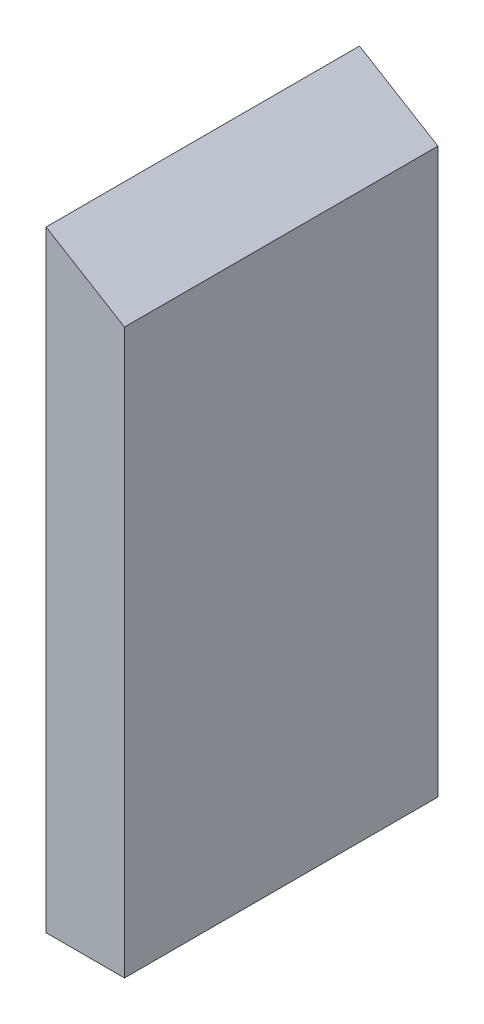
ISO-10303-21;
HEADER;
FILE_DESCRIPTION(('STEP AP214'),'2;1');
FILE_NAME('part.step','',(''),(''),'','','');
FILE_SCHEMA(('AUTOMOTIVE_DESIGN { 1 0 10303 214 1 1 1 1 }'));
ENDSEC;
DATA;
#1=APPLICATION_CONTEXT('core data for automotive mechanical design processes');
#2=APPLICATION_PROTOCOL_DEFINITION('international standard','automotive_design',2000,#1);
#3=PRODUCT_CONTEXT('',#1,'mechanical');
#4=PRODUCT('Part','Part','',(#3));
#5=PRODUCT_RELATED_PRODUCT_CATEGORY('part','',(#4));
#6=PRODUCT_DEFINITION_FORMATION('','',#4);
#7=PRODUCT_DEFINITION_CONTEXT('part definition',#1,'design');
#8=PRODUCT_DEFINITION('design','',#6,#7);
#9=PRODUCT_DEFINITION_SHAPE('','',#8);
#10=(LENGTH_UNIT() NAMED_UNIT(*) SI_UNIT(.MILLI.,.METRE.));
#11=(NAMED_UNIT(*) PLANE_ANGLE_UNIT() SI_UNIT($,.RADIAN.));
#12=(NAMED_UNIT(*) SI_UNIT($,.STERADIAN.) SOLID_ANGLE_UNIT());
#13=UNCERTAINTY_MEASURE_WITH_UNIT(LENGTH_MEASURE(1.E-05),#10,'distance_accuracy_value','');
#14=(GEOMETRIC_REPRESENTATION_CONTEXT(3) GLOBAL_UNCERTAINTY_ASSIGNED_CONTEXT((#13)) GLOBAL_UNIT_ASSIGNED_CONTEXT((#10,
#11,#12)) REPRESENTATION_CONTEXT('',''));
#15=CARTESIAN_POINT('',(0.,0.,0.));
#16=DIRECTION('',(0.,0.,1.));
#17=DIRECTION('',(1.,0.,0.));
#18=AXIS2_PLACEMENT_3D('',#15,#16,#17);
#19=CARTESIAN_POINT('',(0.,0.,40.));
#20=DIRECTION('',(0.,1.,0.));
#21=DIRECTION('',(0.,0.,1.));
#22=AXIS2_PLACEMENT_3D('',#19,#20,#21);
#23=PLANE('',#22);
#24=DIRECTION('',(1.,0.,0.));
#25=VECTOR('',#24,1.);
#26=CARTESIAN_POINT('',(0.,0.,0.));
#27=LINE('',#26,#25);
#28=CARTESIAN_POINT('',(0.,0.,0.));
#29=VERTEX_POINT('',#28);
#30=CARTESIAN_POINT('',(10.,0.,0.));
#31=VERTEX_POINT('',#30);
#32=EDGE_CURVE('E111',#29,#31,#27,.T.);
#33=ORIENTED_EDGE('',*,*,#32,.T.);
#34=DIRECTION('',(0.,0.,-1.));
#35=VECTOR('',#34,1.);
#36=CARTESIAN_POINT('',(10.,0.,40.));
#37=LINE('',#36,#35);
#38=CARTESIAN_POINT('',(10.,0.,40.));
#39=VERTEX_POINT('',#38);
#40=EDGE_CURVE('E11',#39,#31,#37,.T.);
#41=ORIENTED_EDGE('',*,*,#40,.F.);
#42=DIRECTION('',(1.,0.,0.));
#43=VECTOR('',#42,1.);
#44=CARTESIAN_POINT('',(0.,0.,40.));
#45=LINE('',#44,#43);
#46=CARTESIAN_POINT('',(0.,0.,40.));
#47=VERTEX_POINT('',#46);
#48=EDGE_CURVE('E93',#47,#39,#45,.T.);
#49=ORIENTED_EDGE('',*,*,#48,.F.);
#50=DIRECTION('',(0.,0.,-1.));
#51=VECTOR('',#50,1.);
#52=CARTESIAN_POINT('',(0.,0.,40.));
#53=LINE('',#52,#51);
#54=EDGE_CURVE('E60',#47,#29,#53,.T.);
#55=ORIENTED_EDGE('',*,*,#54,.T.);
#56=EDGE_LOOP('',(#33,#41,#49,#55));
#57=FACE_BOUND('',#56,.T.);
#58=ADVANCED_FACE('F43',(#57),#23,.F.);
#59=CARTESIAN_POINT('',(10.,0.,40.));
#60=DIRECTION('',(-1.,0.,0.));
#61=DIRECTION('',(0.,-1.,0.));
#62=AXIS2_PLACEMENT_3D('',#59,#60,#61);
#63=PLANE('',#62);
#64=DIRECTION('',(0.,1.,0.));
#65=VECTOR('',#64,1.);
#66=CARTESIAN_POINT('',(10.,0.,0.));
#67=LINE('',#66,#65);
#68=CARTESIAN_POINT('',(10.,71.9366260294692,0.));
#69=VERTEX_POINT('',#68);
#70=EDGE_CURVE('E99',#31,#69,#67,.T.);
#71=ORIENTED_EDGE('',*,*,#70,.T.);
#72=DIRECTION('',(0.,0.,-1.));
#73=VECTOR('',#72,1.);
#74=CARTESIAN_POINT('',(10.,71.9366260294692,40.));
#75=LINE('',#74,#73);
#76=CARTESIAN_POINT('',(10.,71.9366260294692,40.));
#77=VERTEX_POINT('',#76);
#78=EDGE_CURVE('E52',#77,#69,#75,.T.);
#79=ORIENTED_EDGE('',*,*,#78,.F.);
#80=DIRECTION('',(0.,1.,0.));
#81=VECTOR('',#80,1.);
#82=CARTESIAN_POINT('',(10.,0.,40.));
#83=LINE('',#82,#81);
#84=EDGE_CURVE('E85',#39,#77,#83,.T.);
#85=ORIENTED_EDGE('',*,*,#84,.F.);
#86=ORIENTED_EDGE('',*,*,#40,.T.);
#87=EDGE_LOOP('',(#71,#79,#85,#86));
#88=FACE_BOUND('',#87,.T.);
#89=ADVANCED_FACE('F98',(#88),#63,.F.);
#90=CARTESIAN_POINT('',(0.,78.,40.));
#91=DIRECTION('',(0.518474806021959,0.855092904613581,0.));
#92=DIRECTION('',(-0.855092904613582,0.51847480602196,0.));
#93=AXIS2_PLACEMENT_3D('',#90,#91,#92);
#94=PLANE('',#93);
#95=DIRECTION('',(0.855092904613581,-0.518474806021959,0.));
#96=VECTOR('',#95,1.);
#97=CARTESIAN_POINT('',(0.,78.,0.));
#98=LINE('',#97,#96);
#99=CARTESIAN_POINT('',(0.,78.,0.));
#100=VERTEX_POINT('',#99);
#101=EDGE_CURVE('E116',#100,#69,#98,.T.);
#102=ORIENTED_EDGE('',*,*,#101,.F.);
#103=DIRECTION('',(0.,0.,-1.));
#104=VECTOR('',#103,1.);
#105=CARTESIAN_POINT('',(0.,78.,40.));
#106=LINE('',#105,#104);
#107=CARTESIAN_POINT('',(0.,78.,40.));
#108=VERTEX_POINT('',#107);
#109=EDGE_CURVE('E74',#108,#100,#106,.T.);
#110=ORIENTED_EDGE('',*,*,#109,.F.);
#111=DIRECTION('',(0.855092904613581,-0.518474806021959,0.));
#112=VECTOR('',#111,1.);
#113=CARTESIAN_POINT('',(0.,78.,40.));
#114=LINE('',#113,#112);
#115=EDGE_CURVE('E92',#108,#77,#114,.T.);
#116=ORIENTED_EDGE('',*,*,#115,.T.);
#117=ORIENTED_EDGE('',*,*,#78,.T.);
#118=EDGE_LOOP('',(#102,#110,#116,#117));
#119=FACE_BOUND('',#118,.T.);
#120=ADVANCED_FACE('F103',(#119),#94,.T.);
#121=CARTESIAN_POINT('',(0.,0.,40.));
#122=DIRECTION('',(-1.,0.,0.));
#123=DIRECTION('',(0.,0.,1.));
#124=AXIS2_PLACEMENT_3D('',#121,#122,#123);
#125=PLANE('',#124);
#126=DIRECTION('',(0.,1.,0.));
#127=VECTOR('',#126,1.);
#128=CARTESIAN_POINT('',(0.,0.,0.));
#129=LINE('',#128,#127);
#130=EDGE_CURVE('E119',#29,#100,#129,.T.);
#131=ORIENTED_EDGE('',*,*,#130,.F.);
#132=ORIENTED_EDGE('',*,*,#54,.F.);
#133=DIRECTION('',(0.,1.,0.));
#134=VECTOR('',#133,1.);
#135=CARTESIAN_POINT('',(0.,0.,40.));
#136=LINE('',#135,#134);
#137=EDGE_CURVE('E105',#47,#108,#136,.T.);
#138=ORIENTED_EDGE('',*,*,#137,.T.);
#139=ORIENTED_EDGE('',*,*,#109,.T.);
#140=EDGE_LOOP('',(#131,#132,#138,#139));
#141=FACE_BOUND('',#140,.T.);
#142=ADVANCED_FACE('F129',(#141),#125,.T.);
#143=CARTESIAN_POINT('',(0.,0.,40.));
#144=DIRECTION('',(0.,0.,1.));
#145=DIRECTION('',(1.,0.,0.));
#146=AXIS2_PLACEMENT_3D('',#143,#144,#145);
#147=PLANE('',#146);
#148=ORIENTED_EDGE('',*,*,#48,.T.);
#149=ORIENTED_EDGE('',*,*,#84,.T.);
#150=ORIENTED_EDGE('',*,*,#115,.F.);
#151=ORIENTED_EDGE('',*,*,#137,.F.);
#152=EDGE_LOOP('',(#148,#149,#150,#151));
#153=FACE_BOUND('',#152,.T.);
#154=ADVANCED_FACE('F89',(#153),#147,.T.);
#155=CARTESIAN_POINT('',(0.,0.,0.));
#156=DIRECTION('',(0.,0.,1.));
#157=DIRECTION('',(1.,0.,0.));
#158=AXIS2_PLACEMENT_3D('',#155,#156,#157);
#159=PLANE('',#158);
#160=ORIENTED_EDGE('',*,*,#32,.F.);
#161=ORIENTED_EDGE('',*,*,#130,.T.);
#162=ORIENTED_EDGE('',*,*,#101,.T.);
#163=ORIENTED_EDGE('',*,*,#70,.F.);
#164=EDGE_LOOP('',(#160,#161,#162,#163));
#165=FACE_BOUND('',#164,.T.);
#166=ADVANCED_FACE('F128',(#165),#159,.F.);
#167=CLOSED_SHELL('',(#58,#89,#120,#142,#154,#166));
#168=MANIFOLD_SOLID_BREP('B2',#167);
#169=ADVANCED_BREP_SHAPE_REPRESENTATION('',(#18,#168),#14);
#170=SHAPE_DEFINITION_REPRESENTATION(#9,#169);
ENDSEC;
END-ISO-10303-21;
